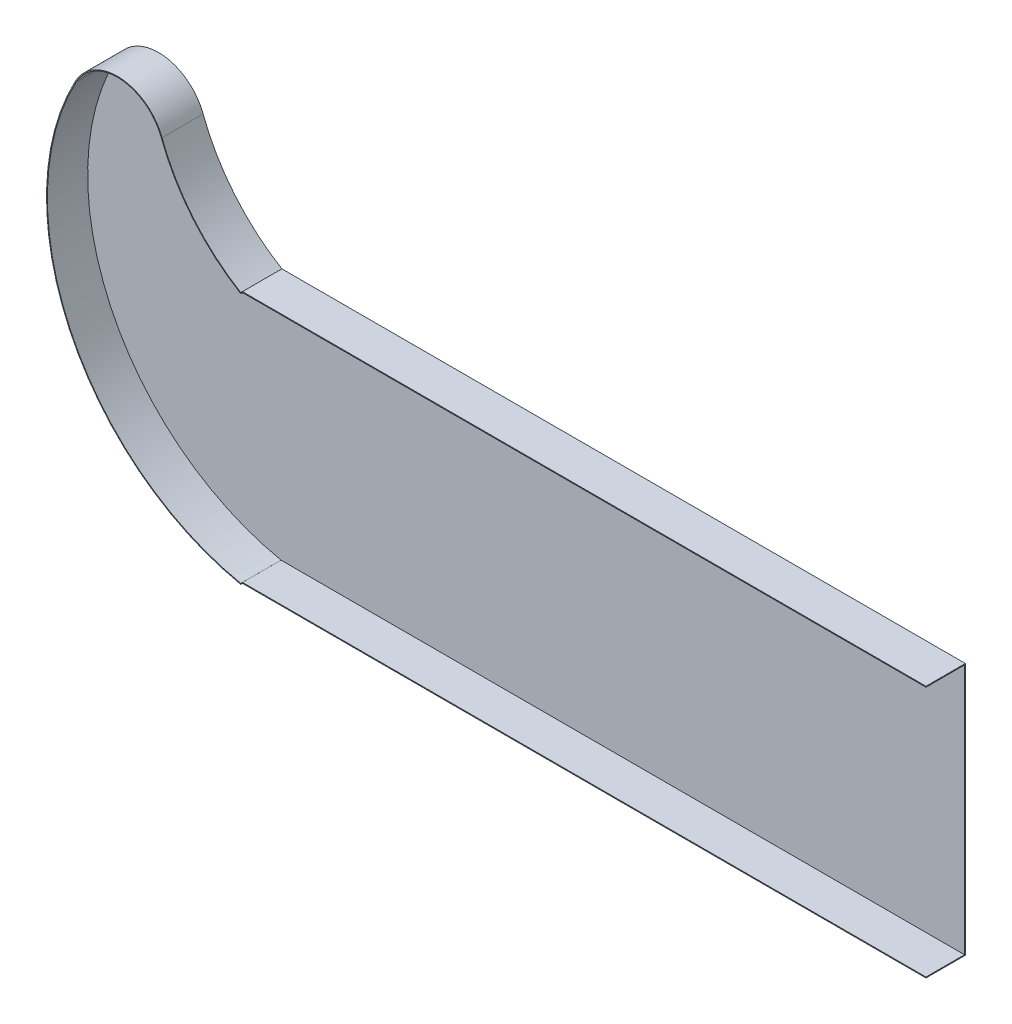
ISO-10303-21;
HEADER;
FILE_DESCRIPTION(('STEP AP214'),'2;1');
FILE_NAME('part.step','',(''),(''),'','','');
FILE_SCHEMA(('AUTOMOTIVE_DESIGN { 1 0 10303 214 1 1 1 1 }'));
ENDSEC;
DATA;
#1=APPLICATION_CONTEXT('core data for automotive mechanical design processes');
#2=APPLICATION_PROTOCOL_DEFINITION('international standard','automotive_design',2000,#1);
#3=PRODUCT_CONTEXT('',#1,'mechanical');
#4=PRODUCT('Part','Part','',(#3));
#5=PRODUCT_RELATED_PRODUCT_CATEGORY('part','',(#4));
#6=PRODUCT_DEFINITION_FORMATION('','',#4);
#7=PRODUCT_DEFINITION_CONTEXT('part definition',#1,'design');
#8=PRODUCT_DEFINITION('design','',#6,#7);
#9=PRODUCT_DEFINITION_SHAPE('','',#8);
#10=(LENGTH_UNIT() NAMED_UNIT(*) SI_UNIT(.MILLI.,.METRE.));
#11=(NAMED_UNIT(*) PLANE_ANGLE_UNIT() SI_UNIT($,.RADIAN.));
#12=(NAMED_UNIT(*) SI_UNIT($,.STERADIAN.) SOLID_ANGLE_UNIT());
#13=UNCERTAINTY_MEASURE_WITH_UNIT(LENGTH_MEASURE(1.E-05),#10,'distance_accuracy_value','');
#14=(GEOMETRIC_REPRESENTATION_CONTEXT(3) GLOBAL_UNCERTAINTY_ASSIGNED_CONTEXT((#13)) GLOBAL_UNIT_ASSIGNED_CONTEXT((#10,
#11,#12)) REPRESENTATION_CONTEXT('',''));
#15=CARTESIAN_POINT('',(0.,0.,0.));
#16=DIRECTION('',(0.,0.,1.));
#17=DIRECTION('',(1.,0.,0.));
#18=AXIS2_PLACEMENT_3D('',#15,#16,#17);
#19=CARTESIAN_POINT('',(-798.,-293.,92.));
#20=DIRECTION('',(0.,-1.,0.));
#21=DIRECTION('',(1.,0.,0.));
#22=AXIS2_PLACEMENT_3D('',#19,#20,#21);
#23=PLANE('',#22);
#24=DIRECTION('',(-1.,0.,0.));
#25=VECTOR('',#24,1.);
#26=CARTESIAN_POINT('',(-798.,-293.,2.));
#27=LINE('',#26,#25);
#28=CARTESIAN_POINT('',(798.,-293.,2.));
#29=VERTEX_POINT('',#28);
#30=CARTESIAN_POINT('',(-797.597254059925,-293.,2.));
#31=VERTEX_POINT('',#30);
#32=EDGE_CURVE('E274',#29,#31,#27,.T.);
#33=ORIENTED_EDGE('',*,*,#32,.T.);
#34=DIRECTION('',(0.,0.,1.));
#35=VECTOR('',#34,1.);
#36=CARTESIAN_POINT('',(-797.597254059925,-293.,92.));
#37=LINE('',#36,#35);
#38=CARTESIAN_POINT('',(-797.597254059925,-293.,92.));
#39=VERTEX_POINT('',#38);
#40=EDGE_CURVE('E214',#31,#39,#37,.T.);
#41=ORIENTED_EDGE('',*,*,#40,.T.);
#42=DIRECTION('',(-1.,0.,0.));
#43=VECTOR('',#42,1.);
#44=CARTESIAN_POINT('',(796.,-293.,92.));
#45=LINE('',#44,#43);
#46=CARTESIAN_POINT('',(798.,-293.,92.));
#47=VERTEX_POINT('',#46);
#48=EDGE_CURVE('E275',#47,#39,#45,.T.);
#49=ORIENTED_EDGE('',*,*,#48,.F.);
#50=DIRECTION('',(0.,0.,-1.));
#51=VECTOR('',#50,1.);
#52=CARTESIAN_POINT('',(798.,-293.,92.));
#53=LINE('',#52,#51);
#54=EDGE_CURVE('E289',#47,#29,#53,.T.);
#55=ORIENTED_EDGE('',*,*,#54,.T.);
#56=EDGE_LOOP('',(#33,#41,#49,#55));
#57=FACE_BOUND('',#56,.T.);
#58=ADVANCED_FACE('F35',(#57),#23,.F.);
#59=CARTESIAN_POINT('',(-798.,295.,96.));
#60=DIRECTION('',(1.,0.,0.));
#61=DIRECTION('',(0.,0.,-1.));
#62=AXIS2_PLACEMENT_3D('',#59,#60,#61);
#63=PLANE('',#62);
#64=DIRECTION('',(0.,0.,1.));
#65=VECTOR('',#64,1.);
#66=CARTESIAN_POINT('',(-798.,292.663113676968,96.));
#67=LINE('',#66,#65);
#68=CARTESIAN_POINT('',(-798.,292.663113676968,2.));
#69=VERTEX_POINT('',#68);
#70=CARTESIAN_POINT('',(-798.,292.663113676968,96.));
#71=VERTEX_POINT('',#70);
#72=EDGE_CURVE('E212',#69,#71,#67,.T.);
#73=ORIENTED_EDGE('',*,*,#72,.F.);
#74=DIRECTION('',(0.,-1.,0.));
#75=VECTOR('',#74,1.);
#76=CARTESIAN_POINT('',(-798.,-295.,2.));
#77=LINE('',#76,#75);
#78=CARTESIAN_POINT('',(-798.,293.,2.));
#79=VERTEX_POINT('',#78);
#80=EDGE_CURVE('E297',#79,#69,#77,.T.);
#81=ORIENTED_EDGE('',*,*,#80,.F.);
#82=DIRECTION('',(0.,0.,-1.));
#83=VECTOR('',#82,1.);
#84=CARTESIAN_POINT('',(-798.,293.,92.));
#85=LINE('',#84,#83);
#86=CARTESIAN_POINT('',(-798.,293.,92.));
#87=VERTEX_POINT('',#86);
#88=EDGE_CURVE('E266',#87,#79,#85,.T.);
#89=ORIENTED_EDGE('',*,*,#88,.F.);
#90=DIRECTION('',(0.,-1.,0.));
#91=VECTOR('',#90,1.);
#92=CARTESIAN_POINT('',(-798.,295.,92.));
#93=LINE('',#92,#91);
#94=CARTESIAN_POINT('',(-798.,295.,92.));
#95=VERTEX_POINT('',#94);
#96=EDGE_CURVE('E256',#95,#87,#93,.T.);
#97=ORIENTED_EDGE('',*,*,#96,.F.);
#98=DIRECTION('',(0.,0.,-1.));
#99=VECTOR('',#98,1.);
#100=CARTESIAN_POINT('',(-798.,295.,96.));
#101=LINE('',#100,#99);
#102=CARTESIAN_POINT('',(-798.,295.,96.));
#103=VERTEX_POINT('',#102);
#104=EDGE_CURVE('E246',#103,#95,#101,.T.);
#105=ORIENTED_EDGE('',*,*,#104,.F.);
#106=DIRECTION('',(0.,-1.,0.));
#107=VECTOR('',#106,1.);
#108=CARTESIAN_POINT('',(-798.,295.,96.));
#109=LINE('',#108,#107);
#110=EDGE_CURVE('E226',#103,#71,#109,.T.);
#111=ORIENTED_EDGE('',*,*,#110,.T.);
#112=EDGE_LOOP('',(#73,#81,#89,#97,#105,#111));
#113=FACE_BOUND('',#112,.T.);
#114=ADVANCED_FACE('F326',(#113),#63,.T.);
#115=CARTESIAN_POINT('',(0.,0.,2.));
#116=DIRECTION('',(0.,0.,-1.));
#117=DIRECTION('',(-1.,0.,0.));
#118=AXIS2_PLACEMENT_3D('',#115,#116,#117);
#119=PLANE('',#118);
#120=CARTESIAN_POINT('',(-797.796347282278,-293.,2.));
#121=VERTEX_POINT('',#120);
#122=CARTESIAN_POINT('',(-798.,-293.,2.));
#123=VERTEX_POINT('',#122);
#124=EDGE_CURVE('E269',#121,#123,#27,.T.);
#125=ORIENTED_EDGE('',*,*,#124,.F.);
#126=CARTESIAN_POINT('',(-683.637256384546,261.240719005059,2.));
#127=DIRECTION('',(0.,0.,1.));
#128=DIRECTION('',(1.,0.,0.));
#129=AXIS2_PLACEMENT_3D('',#126,#127,#128);
#130=CIRCLE('',#129,565.875492169295);
#131=CARTESIAN_POINT('',(-797.5972259934,-293.04097649335,2.));
#132=VERTEX_POINT('',#131);
#133=EDGE_CURVE('E183',#121,#132,#130,.T.);
#134=ORIENTED_EDGE('',*,*,#133,.T.);
#135=DIRECTION('',(-0.000684941914289541,0.99999976542726,0.));
#136=VECTOR('',#135,1.);
#137=CARTESIAN_POINT('',(-797.998398705367,292.6621459074,2.));
#138=LINE('',#137,#136);
#139=EDGE_CURVE('E182',#132,#31,#138,.T.);
#140=ORIENTED_EDGE('',*,*,#139,.T.);
#141=ORIENTED_EDGE('',*,*,#32,.F.);
#142=DIRECTION('',(0.,1.,0.));
#143=VECTOR('',#142,1.);
#144=CARTESIAN_POINT('',(798.,-295.,2.));
#145=LINE('',#144,#143);
#146=CARTESIAN_POINT('',(798.,293.,2.));
#147=VERTEX_POINT('',#146);
#148=EDGE_CURVE('E293',#29,#147,#145,.T.);
#149=ORIENTED_EDGE('',*,*,#148,.T.);
#150=DIRECTION('',(1.,0.,0.));
#151=VECTOR('',#150,1.);
#152=CARTESIAN_POINT('',(796.,293.,2.));
#153=LINE('',#152,#151);
#154=EDGE_CURVE('E242',#79,#147,#153,.T.);
#155=ORIENTED_EDGE('',*,*,#154,.F.);
#156=ORIENTED_EDGE('',*,*,#80,.T.);
#157=DIRECTION('',(-0.855839661642285,0.517241214096498,0.));
#158=VECTOR('',#157,1.);
#159=CARTESIAN_POINT('',(-799.034482428193,293.288320676715,2.));
#160=LINE('',#159,#158);
#161=CARTESIAN_POINT('',(-799.034482428193,293.288320676715,2.));
#162=VERTEX_POINT('',#161);
#163=EDGE_CURVE('E196',#69,#162,#160,.T.);
#164=ORIENTED_EDGE('',*,*,#163,.T.);
#165=CARTESIAN_POINT('',(-571.098354966861,670.436879001351,2.));
#166=DIRECTION('',(0.,0.,-1.));
#167=DIRECTION('',(1.,0.,0.));
#168=AXIS2_PLACEMENT_3D('',#165,#166,#167);
#169=CIRCLE('',#168,440.676653849985);
#170=CARTESIAN_POINT('',(-983.706100417527,515.676542860147,2.));
#171=VERTEX_POINT('',#170);
#172=EDGE_CURVE('E172',#162,#171,#169,.T.);
#173=ORIENTED_EDGE('',*,*,#172,.T.);
#174=CARTESIAN_POINT('',(-1085.95262730895,477.326058543126,2.));
#175=DIRECTION('',(0.,0.,1.));
#176=DIRECTION('',(1.,0.,0.));
#177=AXIS2_PLACEMENT_3D('',#174,#175,#176);
#178=CIRCLE('',#177,109.202160732783);
#179=CARTESIAN_POINT('',(-1182.15642283771,528.997536503109,2.));
#180=VERTEX_POINT('',#179);
#181=EDGE_CURVE('E167',#171,#180,#178,.T.);
#182=ORIENTED_EDGE('',*,*,#181,.T.);
#183=CARTESIAN_POINT('',(-798.,-292.958013861219,2.));
#184=VERTEX_POINT('',#183);
#185=EDGE_CURVE('E175',#180,#184,#130,.T.);
#186=ORIENTED_EDGE('',*,*,#185,.T.);
#187=EDGE_CURVE('E295',#184,#123,#77,.T.);
#188=ORIENTED_EDGE('',*,*,#187,.T.);
#189=EDGE_LOOP('',(#125,#134,#140,#141,#149,#155,#156,#164,#173,#182,#186,#188));
#190=FACE_BOUND('',#189,.T.);
#191=ADVANCED_FACE('F186',(#190),#119,.F.);
#192=CARTESIAN_POINT('',(798.,-295.,2.));
#193=DIRECTION('',(-1.,0.,0.));
#194=DIRECTION('',(0.,0.,1.));
#195=AXIS2_PLACEMENT_3D('',#192,#193,#194);
#196=PLANE('',#195);
#197=DIRECTION('',(0.,1.,0.));
#198=VECTOR('',#197,1.);
#199=CARTESIAN_POINT('',(798.,-295.,0.));
#200=LINE('',#199,#198);
#201=CARTESIAN_POINT('',(798.,-295.,0.));
#202=VERTEX_POINT('',#201);
#203=CARTESIAN_POINT('',(798.,295.,0.));
#204=VERTEX_POINT('',#203);
#205=EDGE_CURVE('E292',#202,#204,#200,.T.);
#206=ORIENTED_EDGE('',*,*,#205,.T.);
#207=DIRECTION('',(0.,0.,-1.));
#208=VECTOR('',#207,1.);
#209=CARTESIAN_POINT('',(798.,295.,2.));
#210=LINE('',#209,#208);
#211=CARTESIAN_POINT('',(798.,295.,92.));
#212=VERTEX_POINT('',#211);
#213=EDGE_CURVE('E314',#212,#204,#210,.T.);
#214=ORIENTED_EDGE('',*,*,#213,.F.);
#215=DIRECTION('',(0.,1.,0.));
#216=VECTOR('',#215,1.);
#217=CARTESIAN_POINT('',(798.,293.,92.));
#218=LINE('',#217,#216);
#219=CARTESIAN_POINT('',(798.,293.,92.));
#220=VERTEX_POINT('',#219);
#221=EDGE_CURVE('E250',#220,#212,#218,.T.);
#222=ORIENTED_EDGE('',*,*,#221,.F.);
#223=DIRECTION('',(0.,0.,-1.));
#224=VECTOR('',#223,1.);
#225=CARTESIAN_POINT('',(798.,293.,92.));
#226=LINE('',#225,#224);
#227=EDGE_CURVE('E261',#220,#147,#226,.T.);
#228=ORIENTED_EDGE('',*,*,#227,.T.);
#229=ORIENTED_EDGE('',*,*,#148,.F.);
#230=ORIENTED_EDGE('',*,*,#54,.F.);
#231=DIRECTION('',(0.,1.,0.));
#232=VECTOR('',#231,1.);
#233=CARTESIAN_POINT('',(798.,-293.,92.));
#234=LINE('',#233,#232);
#235=CARTESIAN_POINT('',(798.,-295.,92.));
#236=VERTEX_POINT('',#235);
#237=EDGE_CURVE('E270',#236,#47,#234,.T.);
#238=ORIENTED_EDGE('',*,*,#237,.F.);
#239=DIRECTION('',(0.,0.,-1.));
#240=VECTOR('',#239,1.);
#241=CARTESIAN_POINT('',(798.,-295.,2.));
#242=LINE('',#241,#240);
#243=EDGE_CURVE('E300',#236,#202,#242,.T.);
#244=ORIENTED_EDGE('',*,*,#243,.T.);
#245=EDGE_LOOP('',(#206,#214,#222,#228,#229,#230,#238,#244));
#246=FACE_BOUND('',#245,.T.);
#247=ADVANCED_FACE('F37',(#246),#196,.F.);
#248=CARTESIAN_POINT('',(-798.,295.,2.));
#249=DIRECTION('',(0.,-1.,0.));
#250=DIRECTION('',(0.,0.,-1.));
#251=AXIS2_PLACEMENT_3D('',#248,#249,#250);
#252=PLANE('',#251);
#253=DIRECTION('',(-1.,0.,0.));
#254=VECTOR('',#253,1.);
#255=CARTESIAN_POINT('',(-798.,295.,0.));
#256=LINE('',#255,#254);
#257=CARTESIAN_POINT('',(-798.,295.,0.));
#258=VERTEX_POINT('',#257);
#259=EDGE_CURVE('E303',#204,#258,#256,.T.);
#260=ORIENTED_EDGE('',*,*,#259,.T.);
#261=DIRECTION('',(0.,0.,-1.));
#262=VECTOR('',#261,1.);
#263=CARTESIAN_POINT('',(-798.,295.,2.));
#264=LINE('',#263,#262);
#265=EDGE_CURVE('E312',#95,#258,#264,.T.);
#266=ORIENTED_EDGE('',*,*,#265,.F.);
#267=DIRECTION('',(-1.,0.,0.));
#268=VECTOR('',#267,1.);
#269=CARTESIAN_POINT('',(798.,295.,92.));
#270=LINE('',#269,#268);
#271=EDGE_CURVE('E253',#212,#95,#270,.T.);
#272=ORIENTED_EDGE('',*,*,#271,.F.);
#273=ORIENTED_EDGE('',*,*,#213,.T.);
#274=EDGE_LOOP('',(#260,#266,#272,#273));
#275=FACE_BOUND('',#274,.T.);
#276=ADVANCED_FACE('F333',(#275),#252,.F.);
#277=CARTESIAN_POINT('',(-798.,-295.,2.));
#278=DIRECTION('',(0.,1.,0.));
#279=DIRECTION('',(0.,0.,1.));
#280=AXIS2_PLACEMENT_3D('',#277,#278,#279);
#281=PLANE('',#280);
#282=DIRECTION('',(1.,0.,0.));
#283=VECTOR('',#282,1.);
#284=CARTESIAN_POINT('',(-798.,-295.,0.));
#285=LINE('',#284,#283);
#286=CARTESIAN_POINT('',(-798.,-295.,0.));
#287=VERTEX_POINT('',#286);
#288=EDGE_CURVE('E296',#287,#202,#285,.T.);
#289=ORIENTED_EDGE('',*,*,#288,.T.);
#290=ORIENTED_EDGE('',*,*,#243,.F.);
#291=DIRECTION('',(1.,0.,0.));
#292=VECTOR('',#291,1.);
#293=CARTESIAN_POINT('',(-798.,-295.,92.));
#294=LINE('',#293,#292);
#295=CARTESIAN_POINT('',(-798.,-295.,92.));
#296=VERTEX_POINT('',#295);
#297=EDGE_CURVE('E281',#296,#236,#294,.T.);
#298=ORIENTED_EDGE('',*,*,#297,.F.);
#299=DIRECTION('',(0.,0.,-1.));
#300=VECTOR('',#299,1.);
#301=CARTESIAN_POINT('',(-798.,-295.,2.));
#302=LINE('',#301,#300);
#303=EDGE_CURVE('E309',#296,#287,#302,.T.);
#304=ORIENTED_EDGE('',*,*,#303,.T.);
#305=EDGE_LOOP('',(#289,#290,#298,#304));
#306=FACE_BOUND('',#305,.T.);
#307=ADVANCED_FACE('F400',(#306),#281,.F.);
#308=CARTESIAN_POINT('',(0.,0.,0.));
#309=DIRECTION('',(0.,0.,-1.));
#310=DIRECTION('',(-1.,0.,0.));
#311=AXIS2_PLACEMENT_3D('',#308,#309,#310);
#312=PLANE('',#311);
#313=ORIENTED_EDGE('',*,*,#205,.F.);
#314=ORIENTED_EDGE('',*,*,#288,.F.);
#315=CARTESIAN_POINT('',(-683.637256384546,261.240719005059,0.));
#316=DIRECTION('',(0.,0.,-1.));
#317=DIRECTION('',(1.,0.,0.));
#318=AXIS2_PLACEMENT_3D('',#315,#316,#317);
#319=CIRCLE('',#318,567.875492169295);
#320=CARTESIAN_POINT('',(-1183.91836225142,529.943881843041,0.));
#321=VERTEX_POINT('',#320);
#322=EDGE_CURVE('E222',#287,#321,#319,.T.);
#323=ORIENTED_EDGE('',*,*,#322,.T.);
#324=CARTESIAN_POINT('',(-1085.95262730895,477.326058543126,0.));
#325=DIRECTION('',(0.,0.,-1.));
#326=DIRECTION('',(-1.,0.,0.));
#327=AXIS2_PLACEMENT_3D('',#324,#325,#326);
#328=CIRCLE('',#327,111.202160732783);
#329=CARTESIAN_POINT('',(-981.833490458066,516.37891878494,0.));
#330=VERTEX_POINT('',#329);
#331=EDGE_CURVE('E217',#321,#330,#328,.T.);
#332=ORIENTED_EDGE('',*,*,#331,.T.);
#333=CARTESIAN_POINT('',(-571.098354966861,670.436879001351,0.));
#334=DIRECTION('',(0.,0.,1.));
#335=DIRECTION('',(1.,0.,0.));
#336=AXIS2_PLACEMENT_3D('',#333,#334,#335);
#337=CIRCLE('',#336,438.676653849985);
#338=EDGE_CURVE('E235',#330,#258,#337,.T.);
#339=ORIENTED_EDGE('',*,*,#338,.T.);
#340=ORIENTED_EDGE('',*,*,#259,.F.);
#341=EDGE_LOOP('',(#313,#314,#323,#332,#339,#340));
#342=FACE_BOUND('',#341,.T.);
#343=ADVANCED_FACE('F345',(#342),#312,.T.);
#344=CARTESIAN_POINT('',(-797.796347282495,-292.999999999956,92.));
#345=VERTEX_POINT('',#344);
#346=CARTESIAN_POINT('',(-798.,-293.,92.));
#347=VERTEX_POINT('',#346);
#348=EDGE_CURVE('E273',#345,#347,#45,.T.);
#349=ORIENTED_EDGE('',*,*,#348,.F.);
#350=DIRECTION('',(0.,0.,1.));
#351=VECTOR('',#350,1.);
#352=CARTESIAN_POINT('',(-797.796347282279,-293.,2.));
#353=LINE('',#352,#351);
#354=EDGE_CURVE('E50',#345,#121,#353,.F.);
#355=ORIENTED_EDGE('',*,*,#354,.T.);
#356=ORIENTED_EDGE('',*,*,#124,.T.);
#357=DIRECTION('',(0.,0.,-1.));
#358=VECTOR('',#357,1.);
#359=CARTESIAN_POINT('',(-798.,-293.,92.));
#360=LINE('',#359,#358);
#361=EDGE_CURVE('E284',#347,#123,#360,.T.);
#362=ORIENTED_EDGE('',*,*,#361,.F.);
#363=EDGE_LOOP('',(#349,#355,#356,#362));
#364=FACE_BOUND('',#363,.T.);
#365=ADVANCED_FACE('F362',(#364),#23,.F.);
#366=CARTESIAN_POINT('',(0.,0.,92.));
#367=DIRECTION('',(0.,0.,1.));
#368=DIRECTION('',(1.,0.,0.));
#369=AXIS2_PLACEMENT_3D('',#366,#367,#368);
#370=PLANE('',#369);
#371=DIRECTION('',(-0.000684941914289541,0.99999976542726,0.));
#372=VECTOR('',#371,1.);
#373=CARTESIAN_POINT('',(-797.797567804632,-0.546445121488774,92.));
#374=LINE('',#373,#372);
#375=CARTESIAN_POINT('',(-797.5972259934,-293.04097649335,92.));
#376=VERTEX_POINT('',#375);
#377=EDGE_CURVE('E11',#376,#39,#374,.T.);
#378=ORIENTED_EDGE('',*,*,#377,.F.);
#379=CARTESIAN_POINT('',(-683.637256384546,261.240719005059,92.));
#380=DIRECTION('',(0.,0.,1.));
#381=DIRECTION('',(1.,0.,0.));
#382=AXIS2_PLACEMENT_3D('',#379,#380,#381);
#383=CIRCLE('',#382,565.875492169295);
#384=EDGE_CURVE('E209',#345,#376,#383,.T.);
#385=ORIENTED_EDGE('',*,*,#384,.F.);
#386=ORIENTED_EDGE('',*,*,#348,.T.);
#387=DIRECTION('',(0.,-1.,0.));
#388=VECTOR('',#387,1.);
#389=CARTESIAN_POINT('',(-798.,-293.,92.));
#390=LINE('',#389,#388);
#391=EDGE_CURVE('E278',#347,#296,#390,.T.);
#392=ORIENTED_EDGE('',*,*,#391,.T.);
#393=ORIENTED_EDGE('',*,*,#297,.T.);
#394=ORIENTED_EDGE('',*,*,#237,.T.);
#395=ORIENTED_EDGE('',*,*,#48,.T.);
#396=EDGE_LOOP('',(#378,#385,#386,#392,#393,#394,#395));
#397=FACE_BOUND('',#396,.T.);
#398=ADVANCED_FACE('F365',(#397),#370,.T.);
#399=CARTESIAN_POINT('',(796.,293.,92.));
#400=DIRECTION('',(0.,1.,0.));
#401=DIRECTION('',(0.,0.,1.));
#402=AXIS2_PLACEMENT_3D('',#399,#400,#401);
#403=PLANE('',#402);
#404=ORIENTED_EDGE('',*,*,#154,.T.);
#405=ORIENTED_EDGE('',*,*,#227,.F.);
#406=DIRECTION('',(1.,0.,0.));
#407=VECTOR('',#406,1.);
#408=CARTESIAN_POINT('',(796.,293.,92.));
#409=LINE('',#408,#407);
#410=EDGE_CURVE('E259',#87,#220,#409,.T.);
#411=ORIENTED_EDGE('',*,*,#410,.F.);
#412=ORIENTED_EDGE('',*,*,#88,.T.);
#413=EDGE_LOOP('',(#404,#405,#411,#412));
#414=FACE_BOUND('',#413,.T.);
#415=ADVANCED_FACE('F375',(#414),#403,.F.);
#416=CARTESIAN_POINT('',(0.,0.,92.));
#417=DIRECTION('',(0.,0.,1.));
#418=DIRECTION('',(1.,0.,0.));
#419=AXIS2_PLACEMENT_3D('',#416,#417,#418);
#420=PLANE('',#419);
#421=ORIENTED_EDGE('',*,*,#221,.T.);
#422=ORIENTED_EDGE('',*,*,#271,.T.);
#423=ORIENTED_EDGE('',*,*,#96,.T.);
#424=ORIENTED_EDGE('',*,*,#410,.T.);
#425=EDGE_LOOP('',(#421,#422,#423,#424));
#426=FACE_BOUND('',#425,.T.);
#427=ADVANCED_FACE('F335',(#426),#420,.T.);
#428=CARTESIAN_POINT('',(-1085.95262730895,477.326058543126,96.));
#429=DIRECTION('',(0.,0.,-1.));
#430=DIRECTION('',(-1.,0.,0.));
#431=AXIS2_PLACEMENT_3D('',#428,#429,#430);
#432=CYLINDRICAL_SURFACE('',#431,111.202160732783);
#433=ORIENTED_EDGE('',*,*,#331,.F.);
#434=DIRECTION('',(0.,0.,-1.));
#435=VECTOR('',#434,1.);
#436=CARTESIAN_POINT('',(-1183.91836225142,529.943881843041,96.));
#437=LINE('',#436,#435);
#438=CARTESIAN_POINT('',(-1183.91836225142,529.943881843041,96.));
#439=VERTEX_POINT('',#438);
#440=EDGE_CURVE('E240',#439,#321,#437,.T.);
#441=ORIENTED_EDGE('',*,*,#440,.F.);
#442=CARTESIAN_POINT('',(-1085.95262730895,477.326058543126,96.));
#443=DIRECTION('',(0.,0.,-1.));
#444=DIRECTION('',(-1.,0.,0.));
#445=AXIS2_PLACEMENT_3D('',#442,#443,#444);
#446=CIRCLE('',#445,111.202160732783);
#447=CARTESIAN_POINT('',(-981.833490458066,516.37891878494,96.));
#448=VERTEX_POINT('',#447);
#449=EDGE_CURVE('E218',#439,#448,#446,.T.);
#450=ORIENTED_EDGE('',*,*,#449,.T.);
#451=DIRECTION('',(0.,0.,-1.));
#452=VECTOR('',#451,1.);
#453=CARTESIAN_POINT('',(-981.833490458066,516.37891878494,96.));
#454=LINE('',#453,#452);
#455=EDGE_CURVE('E232',#448,#330,#454,.T.);
#456=ORIENTED_EDGE('',*,*,#455,.T.);
#457=EDGE_LOOP('',(#433,#441,#450,#456));
#458=FACE_BOUND('',#457,.T.);
#459=ADVANCED_FACE('F350',(#458),#432,.T.);
#460=CARTESIAN_POINT('',(-683.637256384546,261.240719005059,96.));
#461=DIRECTION('',(0.,0.,-1.));
#462=DIRECTION('',(-1.,0.,0.));
#463=AXIS2_PLACEMENT_3D('',#460,#461,#462);
#464=CYLINDRICAL_SURFACE('',#463,567.875492169295);
#465=ORIENTED_EDGE('',*,*,#322,.F.);
#466=ORIENTED_EDGE('',*,*,#303,.F.);
#467=DIRECTION('',(0.,0.,-1.));
#468=VECTOR('',#467,1.);
#469=CARTESIAN_POINT('',(-798.,-295.,96.));
#470=LINE('',#469,#468);
#471=CARTESIAN_POINT('',(-798.,-295.,96.));
#472=VERTEX_POINT('',#471);
#473=EDGE_CURVE('E243',#472,#296,#470,.T.);
#474=ORIENTED_EDGE('',*,*,#473,.F.);
#475=CARTESIAN_POINT('',(-683.637256384546,261.240719005059,96.));
#476=DIRECTION('',(0.,0.,-1.));
#477=DIRECTION('',(1.,0.,0.));
#478=AXIS2_PLACEMENT_3D('',#475,#476,#477);
#479=CIRCLE('',#478,567.875492169295);
#480=EDGE_CURVE('E229',#472,#439,#479,.T.);
#481=ORIENTED_EDGE('',*,*,#480,.T.);
#482=ORIENTED_EDGE('',*,*,#440,.T.);
#483=EDGE_LOOP('',(#465,#466,#474,#481,#482));
#484=FACE_BOUND('',#483,.T.);
#485=ADVANCED_FACE('F352',(#484),#464,.T.);
#486=DIRECTION('',(0.,0.,1.));
#487=VECTOR('',#486,1.);
#488=CARTESIAN_POINT('',(-798.,-292.958013861219,2.));
#489=LINE('',#488,#487);
#490=CARTESIAN_POINT('',(-798.,-292.958013861219,96.));
#491=VERTEX_POINT('',#490);
#492=EDGE_CURVE('E178',#491,#184,#489,.F.);
#493=ORIENTED_EDGE('',*,*,#492,.F.);
#494=EDGE_CURVE('E225',#491,#472,#109,.T.);
#495=ORIENTED_EDGE('',*,*,#494,.T.);
#496=ORIENTED_EDGE('',*,*,#473,.T.);
#497=ORIENTED_EDGE('',*,*,#391,.F.);
#498=ORIENTED_EDGE('',*,*,#361,.T.);
#499=ORIENTED_EDGE('',*,*,#187,.F.);
#500=EDGE_LOOP('',(#493,#495,#496,#497,#498,#499));
#501=FACE_BOUND('',#500,.T.);
#502=ADVANCED_FACE('F356',(#501),#63,.T.);
#503=CARTESIAN_POINT('',(-571.098354966861,670.436879001351,96.));
#504=DIRECTION('',(0.,0.,-1.));
#505=DIRECTION('',(-1.,0.,0.));
#506=AXIS2_PLACEMENT_3D('',#503,#504,#505);
#507=CYLINDRICAL_SURFACE('',#506,438.676653849985);
#508=ORIENTED_EDGE('',*,*,#338,.F.);
#509=ORIENTED_EDGE('',*,*,#455,.F.);
#510=CARTESIAN_POINT('',(-571.098354966861,670.436879001351,96.));
#511=DIRECTION('',(0.,0.,1.));
#512=DIRECTION('',(1.,0.,0.));
#513=AXIS2_PLACEMENT_3D('',#510,#511,#512);
#514=CIRCLE('',#513,438.676653849985);
#515=EDGE_CURVE('E221',#448,#103,#514,.T.);
#516=ORIENTED_EDGE('',*,*,#515,.T.);
#517=ORIENTED_EDGE('',*,*,#104,.T.);
#518=ORIENTED_EDGE('',*,*,#265,.T.);
#519=EDGE_LOOP('',(#508,#509,#516,#517,#518));
#520=FACE_BOUND('',#519,.T.);
#521=ADVANCED_FACE('F330',(#520),#507,.F.);
#522=CARTESIAN_POINT('',(-1085.95262730895,477.326058543126,96.));
#523=DIRECTION('',(0.,0.,-1.));
#524=DIRECTION('',(-1.,0.,0.));
#525=AXIS2_PLACEMENT_3D('',#522,#523,#524);
#526=PLANE('',#525);
#527=CARTESIAN_POINT('',(-571.098354966861,670.436879001351,96.));
#528=DIRECTION('',(0.,0.,-1.));
#529=DIRECTION('',(1.,0.,0.));
#530=AXIS2_PLACEMENT_3D('',#527,#528,#529);
#531=CIRCLE('',#530,440.676653849985);
#532=CARTESIAN_POINT('',(-799.034482428193,293.288320676715,96.));
#533=VERTEX_POINT('',#532);
#534=CARTESIAN_POINT('',(-983.706100417527,515.676542860147,96.));
#535=VERTEX_POINT('',#534);
#536=EDGE_CURVE('E188',#533,#535,#531,.T.);
#537=ORIENTED_EDGE('',*,*,#536,.F.);
#538=DIRECTION('',(0.855839661642285,-0.517241214096498,0.));
#539=VECTOR('',#538,1.);
#540=CARTESIAN_POINT('',(-1090.65999082289,469.537142487718,96.));
#541=LINE('',#540,#539);
#542=EDGE_CURVE('E43',#533,#71,#541,.T.);
#543=ORIENTED_EDGE('',*,*,#542,.T.);
#544=ORIENTED_EDGE('',*,*,#110,.F.);
#545=ORIENTED_EDGE('',*,*,#515,.F.);
#546=ORIENTED_EDGE('',*,*,#449,.F.);
#547=ORIENTED_EDGE('',*,*,#480,.F.);
#548=ORIENTED_EDGE('',*,*,#494,.F.);
#549=CARTESIAN_POINT('',(-683.637256384546,261.240719005059,96.));
#550=DIRECTION('',(0.,0.,1.));
#551=DIRECTION('',(1.,0.,0.));
#552=AXIS2_PLACEMENT_3D('',#549,#550,#551);
#553=CIRCLE('',#552,565.875492169295);
#554=CARTESIAN_POINT('',(-1182.15642283771,528.997536503109,96.));
#555=VERTEX_POINT('',#554);
#556=EDGE_CURVE('E191',#555,#491,#553,.T.);
#557=ORIENTED_EDGE('',*,*,#556,.F.);
#558=CARTESIAN_POINT('',(-1085.95262730895,477.326058543126,96.));
#559=DIRECTION('',(0.,0.,1.));
#560=DIRECTION('',(1.,0.,0.));
#561=AXIS2_PLACEMENT_3D('',#558,#559,#560);
#562=CIRCLE('',#561,109.202160732783);
#563=EDGE_CURVE('E58',#535,#555,#562,.T.);
#564=ORIENTED_EDGE('',*,*,#563,.F.);
#565=EDGE_LOOP('',(#537,#543,#544,#545,#546,#547,#548,#557,#564));
#566=FACE_BOUND('',#565,.T.);
#567=ADVANCED_FACE('F320',(#566),#526,.F.);
#568=CARTESIAN_POINT('',(-683.637256384546,261.240719005059,2.));
#569=DIRECTION('',(0.,0.,1.));
#570=DIRECTION('',(1.,0.,0.));
#571=AXIS2_PLACEMENT_3D('',#568,#569,#570);
#572=CYLINDRICAL_SURFACE('',#571,565.875492169295);
#573=ORIENTED_EDGE('',*,*,#492,.T.);
#574=ORIENTED_EDGE('',*,*,#185,.F.);
#575=DIRECTION('',(0.,0.,1.));
#576=VECTOR('',#575,1.);
#577=CARTESIAN_POINT('',(-1182.15642283771,528.997536503109,2.));
#578=LINE('',#577,#576);
#579=EDGE_CURVE('E163',#180,#555,#578,.T.);
#580=ORIENTED_EDGE('',*,*,#579,.T.);
#581=ORIENTED_EDGE('',*,*,#556,.T.);
#582=EDGE_LOOP('',(#573,#574,#580,#581));
#583=FACE_BOUND('',#582,.T.);
#584=ADVANCED_FACE('F176',(#583),#572,.F.);
#585=CARTESIAN_POINT('',(-799.034482428193,293.288320676715,2.));
#586=DIRECTION('',(0.517241214096498,0.855839661642285,0.));
#587=DIRECTION('',(-0.855839661642285,0.517241214096498,0.));
#588=AXIS2_PLACEMENT_3D('',#585,#586,#587);
#589=PLANE('',#588);
#590=ORIENTED_EDGE('',*,*,#72,.T.);
#591=ORIENTED_EDGE('',*,*,#542,.F.);
#592=DIRECTION('',(0.,0.,1.));
#593=VECTOR('',#592,1.);
#594=CARTESIAN_POINT('',(-799.034482428193,293.288320676715,2.));
#595=LINE('',#594,#593);
#596=EDGE_CURVE('E203',#162,#533,#595,.T.);
#597=ORIENTED_EDGE('',*,*,#596,.F.);
#598=ORIENTED_EDGE('',*,*,#163,.F.);
#599=EDGE_LOOP('',(#590,#591,#597,#598));
#600=FACE_BOUND('',#599,.T.);
#601=ADVANCED_FACE('F376',(#600),#589,.F.);
#602=CARTESIAN_POINT('',(-571.098354966861,670.436879001351,2.));
#603=DIRECTION('',(0.,0.,1.));
#604=DIRECTION('',(1.,0.,0.));
#605=AXIS2_PLACEMENT_3D('',#602,#603,#604);
#606=CYLINDRICAL_SURFACE('',#605,440.676653849985);
#607=ORIENTED_EDGE('',*,*,#536,.T.);
#608=DIRECTION('',(0.,0.,1.));
#609=VECTOR('',#608,1.);
#610=CARTESIAN_POINT('',(-983.706100417527,515.676542860147,2.));
#611=LINE('',#610,#609);
#612=EDGE_CURVE('E201',#171,#535,#611,.T.);
#613=ORIENTED_EDGE('',*,*,#612,.F.);
#614=ORIENTED_EDGE('',*,*,#172,.F.);
#615=ORIENTED_EDGE('',*,*,#596,.T.);
#616=EDGE_LOOP('',(#607,#613,#614,#615));
#617=FACE_BOUND('',#616,.T.);
#618=ADVANCED_FACE('F378',(#617),#606,.T.);
#619=CARTESIAN_POINT('',(-1085.95262730895,477.326058543126,2.));
#620=DIRECTION('',(0.,0.,1.));
#621=DIRECTION('',(1.,0.,0.));
#622=AXIS2_PLACEMENT_3D('',#619,#620,#621);
#623=CYLINDRICAL_SURFACE('',#622,109.202160732783);
#624=ORIENTED_EDGE('',*,*,#563,.T.);
#625=ORIENTED_EDGE('',*,*,#579,.F.);
#626=ORIENTED_EDGE('',*,*,#181,.F.);
#627=ORIENTED_EDGE('',*,*,#612,.T.);
#628=EDGE_LOOP('',(#624,#625,#626,#627));
#629=FACE_BOUND('',#628,.T.);
#630=ADVANCED_FACE('F165',(#629),#623,.F.);
#631=CARTESIAN_POINT('',(-797.998398705367,292.6621459074,2.));
#632=DIRECTION('',(0.999999765427259,0.000684941914289541,0.));
#633=DIRECTION('',(-0.000684941914289541,0.99999976542726,0.));
#634=AXIS2_PLACEMENT_3D('',#631,#632,#633);
#635=PLANE('',#634);
#636=ORIENTED_EDGE('',*,*,#139,.F.);
#637=DIRECTION('',(0.,0.,1.));
#638=VECTOR('',#637,1.);
#639=CARTESIAN_POINT('',(-797.5972259934,-293.04097649335,2.));
#640=LINE('',#639,#638);
#641=EDGE_CURVE('E171',#132,#376,#640,.T.);
#642=ORIENTED_EDGE('',*,*,#641,.T.);
#643=ORIENTED_EDGE('',*,*,#377,.T.);
#644=ORIENTED_EDGE('',*,*,#40,.F.);
#645=EDGE_LOOP('',(#636,#642,#643,#644));
#646=FACE_BOUND('',#645,.T.);
#647=ADVANCED_FACE('F370',(#646),#635,.F.);
#648=ORIENTED_EDGE('',*,*,#384,.T.);
#649=ORIENTED_EDGE('',*,*,#641,.F.);
#650=ORIENTED_EDGE('',*,*,#133,.F.);
#651=ORIENTED_EDGE('',*,*,#354,.F.);
#652=EDGE_LOOP('',(#648,#649,#650,#651));
#653=FACE_BOUND('',#652,.T.);
#654=ADVANCED_FACE('F367',(#653),#572,.F.);
#655=CLOSED_SHELL('',(#58,#114,#191,#247,#276,#307,#343,#365,#398,#415,#427,#459,#485,#502,#521,
#567,#584,#601,#618,#630,#647,#654));
#656=MANIFOLD_SOLID_BREP('B2',#655);
#657=ADVANCED_BREP_SHAPE_REPRESENTATION('',(#18,#656),#14);
#658=SHAPE_DEFINITION_REPRESENTATION(#9,#657);
ENDSEC;
END-ISO-10303-21;
